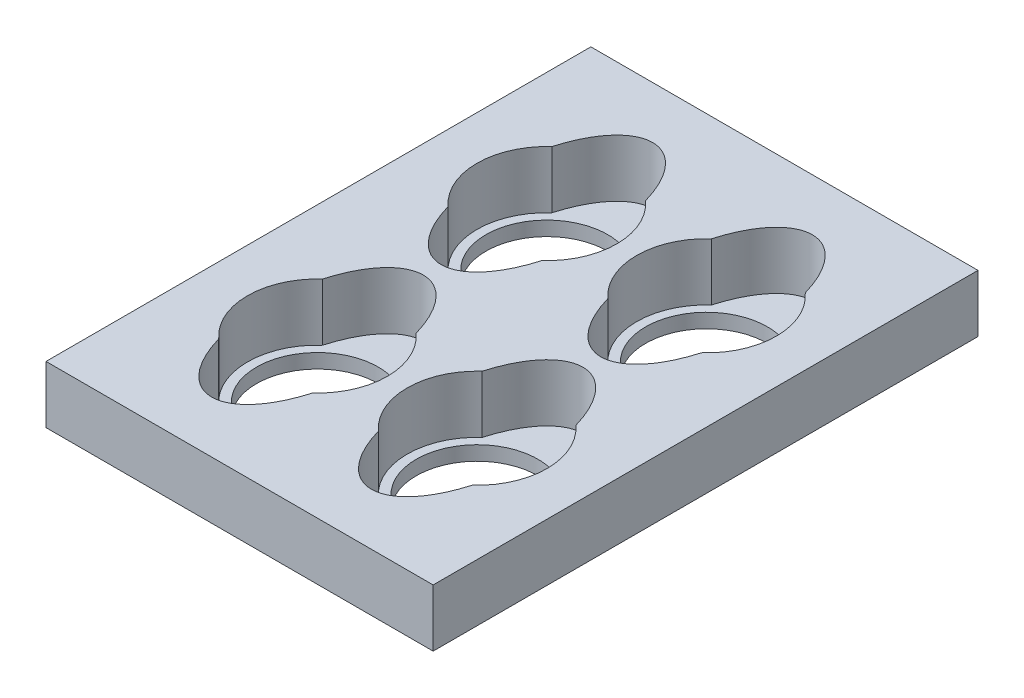
ISO-10303-21;
HEADER;
FILE_DESCRIPTION(('STEP AP214'),'2;1');
FILE_NAME('part.step','',(''),(''),'','','');
FILE_SCHEMA(('AUTOMOTIVE_DESIGN { 1 0 10303 214 1 1 1 1 }'));
ENDSEC;
DATA;
#1=APPLICATION_CONTEXT('core data for automotive mechanical design processes');
#2=APPLICATION_PROTOCOL_DEFINITION('international standard','automotive_design',2000,#1);
#3=PRODUCT_CONTEXT('',#1,'mechanical');
#4=PRODUCT('Part','Part','',(#3));
#5=PRODUCT_RELATED_PRODUCT_CATEGORY('part','',(#4));
#6=PRODUCT_DEFINITION_FORMATION('','',#4);
#7=PRODUCT_DEFINITION_CONTEXT('part definition',#1,'design');
#8=PRODUCT_DEFINITION('design','',#6,#7);
#9=PRODUCT_DEFINITION_SHAPE('','',#8);
#10=(LENGTH_UNIT() NAMED_UNIT(*) SI_UNIT(.MILLI.,.METRE.));
#11=(NAMED_UNIT(*) PLANE_ANGLE_UNIT() SI_UNIT($,.RADIAN.));
#12=(NAMED_UNIT(*) SI_UNIT($,.STERADIAN.) SOLID_ANGLE_UNIT());
#13=UNCERTAINTY_MEASURE_WITH_UNIT(LENGTH_MEASURE(1.E-05),#10,'distance_accuracy_value','');
#14=(GEOMETRIC_REPRESENTATION_CONTEXT(3) GLOBAL_UNCERTAINTY_ASSIGNED_CONTEXT((#13)) GLOBAL_UNIT_ASSIGNED_CONTEXT((#10,
#11,#12)) REPRESENTATION_CONTEXT('',''));
#15=CARTESIAN_POINT('',(0.,0.,0.));
#16=DIRECTION('',(0.,0.,1.));
#17=DIRECTION('',(1.,0.,0.));
#18=AXIS2_PLACEMENT_3D('',#15,#16,#17);
#19=CARTESIAN_POINT('',(0.,0.,0.));
#20=DIRECTION('',(0.,1.,0.));
#21=DIRECTION('',(0.,0.,1.));
#22=AXIS2_PLACEMENT_3D('',#19,#20,#21);
#23=PLANE('',#22);
#24=DIRECTION('',(0.,0.,-1.));
#25=VECTOR('',#24,1.);
#26=CARTESIAN_POINT('',(54.,0.,-76.));
#27=LINE('',#26,#25);
#28=CARTESIAN_POINT('',(54.,0.,76.));
#29=VERTEX_POINT('',#28);
#30=CARTESIAN_POINT('',(54.,0.,-76.));
#31=VERTEX_POINT('',#30);
#32=EDGE_CURVE('E421',#29,#31,#27,.T.);
#33=ORIENTED_EDGE('',*,*,#32,.F.);
#34=DIRECTION('',(1.,0.,0.));
#35=VECTOR('',#34,1.);
#36=CARTESIAN_POINT('',(-54.,0.,76.));
#37=LINE('',#36,#35);
#38=CARTESIAN_POINT('',(-54.,0.,76.));
#39=VERTEX_POINT('',#38);
#40=EDGE_CURVE('E431',#39,#29,#37,.T.);
#41=ORIENTED_EDGE('',*,*,#40,.F.);
#42=DIRECTION('',(0.,0.,1.));
#43=VECTOR('',#42,1.);
#44=CARTESIAN_POINT('',(-54.,0.,-76.));
#45=LINE('',#44,#43);
#46=CARTESIAN_POINT('',(-54.,0.,-76.));
#47=VERTEX_POINT('',#46);
#48=EDGE_CURVE('E420',#47,#39,#45,.T.);
#49=ORIENTED_EDGE('',*,*,#48,.F.);
#50=DIRECTION('',(-1.,0.,0.));
#51=VECTOR('',#50,1.);
#52=CARTESIAN_POINT('',(-54.,0.,-76.));
#53=LINE('',#52,#51);
#54=EDGE_CURVE('E412',#31,#47,#53,.T.);
#55=ORIENTED_EDGE('',*,*,#54,.F.);
#56=EDGE_LOOP('',(#33,#41,#49,#55));
#57=FACE_BOUND('',#56,.T.);
#58=DIRECTION('',(0.,0.,1.));
#59=VECTOR('',#58,1.);
#60=CARTESIAN_POINT('',(49.,0.,-69.));
#61=LINE('',#60,#59);
#62=CARTESIAN_POINT('',(49.,0.,-69.));
#63=VERTEX_POINT('',#62);
#64=CARTESIAN_POINT('',(49.,0.,69.));
#65=VERTEX_POINT('',#64);
#66=EDGE_CURVE('E573',#63,#65,#61,.T.);
#67=ORIENTED_EDGE('',*,*,#66,.F.);
#68=DIRECTION('',(1.,0.,0.));
#69=VECTOR('',#68,1.);
#70=CARTESIAN_POINT('',(-49.,0.,-69.));
#71=LINE('',#70,#69);
#72=CARTESIAN_POINT('',(-49.,0.,-69.));
#73=VERTEX_POINT('',#72);
#74=EDGE_CURVE('E568',#73,#63,#71,.T.);
#75=ORIENTED_EDGE('',*,*,#74,.F.);
#76=DIRECTION('',(0.,0.,-1.));
#77=VECTOR('',#76,1.);
#78=CARTESIAN_POINT('',(-49.,0.,-69.));
#79=LINE('',#78,#77);
#80=CARTESIAN_POINT('',(-49.,0.,69.));
#81=VERTEX_POINT('',#80);
#82=EDGE_CURVE('E607',#81,#73,#79,.T.);
#83=ORIENTED_EDGE('',*,*,#82,.F.);
#84=DIRECTION('',(-1.,0.,0.));
#85=VECTOR('',#84,1.);
#86=CARTESIAN_POINT('',(-49.,0.,69.));
#87=LINE('',#86,#85);
#88=EDGE_CURVE('E611',#65,#81,#87,.T.);
#89=ORIENTED_EDGE('',*,*,#88,.F.);
#90=EDGE_LOOP('',(#67,#75,#83,#89));
#91=FACE_BOUND('',#90,.T.);
#92=ADVANCED_FACE('F67',(#57,#91),#23,.F.);
#93=CARTESIAN_POINT('',(54.,16.,-76.));
#94=DIRECTION('',(-1.,0.,0.));
#95=DIRECTION('',(0.,0.,1.));
#96=AXIS2_PLACEMENT_3D('',#93,#94,#95);
#97=PLANE('',#96);
#98=ORIENTED_EDGE('',*,*,#32,.T.);
#99=DIRECTION('',(0.,-1.,0.));
#100=VECTOR('',#99,1.);
#101=CARTESIAN_POINT('',(54.,16.,-76.));
#102=LINE('',#101,#100);
#103=CARTESIAN_POINT('',(54.,16.,-76.));
#104=VERTEX_POINT('',#103);
#105=EDGE_CURVE('E12',#104,#31,#102,.T.);
#106=ORIENTED_EDGE('',*,*,#105,.F.);
#107=DIRECTION('',(0.,0.,-1.));
#108=VECTOR('',#107,1.);
#109=CARTESIAN_POINT('',(54.,16.,-76.));
#110=LINE('',#109,#108);
#111=CARTESIAN_POINT('',(54.,16.,76.));
#112=VERTEX_POINT('',#111);
#113=EDGE_CURVE('E435',#112,#104,#110,.T.);
#114=ORIENTED_EDGE('',*,*,#113,.F.);
#115=DIRECTION('',(0.,-1.,0.));
#116=VECTOR('',#115,1.);
#117=CARTESIAN_POINT('',(54.,16.,76.));
#118=LINE('',#117,#116);
#119=EDGE_CURVE('E439',#112,#29,#118,.T.);
#120=ORIENTED_EDGE('',*,*,#119,.T.);
#121=EDGE_LOOP('',(#98,#106,#114,#120));
#122=FACE_BOUND('',#121,.T.);
#123=ADVANCED_FACE('F69',(#122),#97,.F.);
#124=CARTESIAN_POINT('',(-54.,16.,-76.));
#125=DIRECTION('',(0.,0.,1.));
#126=DIRECTION('',(1.,0.,0.));
#127=AXIS2_PLACEMENT_3D('',#124,#125,#126);
#128=PLANE('',#127);
#129=ORIENTED_EDGE('',*,*,#54,.T.);
#130=DIRECTION('',(0.,-1.,0.));
#131=VECTOR('',#130,1.);
#132=CARTESIAN_POINT('',(-54.,16.,-76.));
#133=LINE('',#132,#131);
#134=CARTESIAN_POINT('',(-54.,16.,-76.));
#135=VERTEX_POINT('',#134);
#136=EDGE_CURVE('E77',#135,#47,#133,.T.);
#137=ORIENTED_EDGE('',*,*,#136,.F.);
#138=DIRECTION('',(-1.,0.,0.));
#139=VECTOR('',#138,1.);
#140=CARTESIAN_POINT('',(-54.,16.,-76.));
#141=LINE('',#140,#139);
#142=EDGE_CURVE('E588',#104,#135,#141,.T.);
#143=ORIENTED_EDGE('',*,*,#142,.F.);
#144=ORIENTED_EDGE('',*,*,#105,.T.);
#145=EDGE_LOOP('',(#129,#137,#143,#144));
#146=FACE_BOUND('',#145,.T.);
#147=ADVANCED_FACE('F403',(#146),#128,.F.);
#148=CARTESIAN_POINT('',(-54.,16.,-76.));
#149=DIRECTION('',(1.,0.,0.));
#150=DIRECTION('',(0.,0.,-1.));
#151=AXIS2_PLACEMENT_3D('',#148,#149,#150);
#152=PLANE('',#151);
#153=ORIENTED_EDGE('',*,*,#48,.T.);
#154=DIRECTION('',(0.,-1.,0.));
#155=VECTOR('',#154,1.);
#156=CARTESIAN_POINT('',(-54.,16.,76.));
#157=LINE('',#156,#155);
#158=CARTESIAN_POINT('',(-54.,16.,76.));
#159=VERTEX_POINT('',#158);
#160=EDGE_CURVE('E427',#159,#39,#157,.T.);
#161=ORIENTED_EDGE('',*,*,#160,.F.);
#162=DIRECTION('',(0.,0.,1.));
#163=VECTOR('',#162,1.);
#164=CARTESIAN_POINT('',(-54.,16.,-76.));
#165=LINE('',#164,#163);
#166=EDGE_CURVE('E425',#135,#159,#165,.T.);
#167=ORIENTED_EDGE('',*,*,#166,.F.);
#168=ORIENTED_EDGE('',*,*,#136,.T.);
#169=EDGE_LOOP('',(#153,#161,#167,#168));
#170=FACE_BOUND('',#169,.T.);
#171=ADVANCED_FACE('F400',(#170),#152,.F.);
#172=CARTESIAN_POINT('',(-54.,16.,76.));
#173=DIRECTION('',(0.,0.,-1.));
#174=DIRECTION('',(-1.,0.,0.));
#175=AXIS2_PLACEMENT_3D('',#172,#173,#174);
#176=PLANE('',#175);
#177=ORIENTED_EDGE('',*,*,#40,.T.);
#178=ORIENTED_EDGE('',*,*,#119,.F.);
#179=DIRECTION('',(1.,0.,0.));
#180=VECTOR('',#179,1.);
#181=CARTESIAN_POINT('',(-54.,16.,76.));
#182=LINE('',#181,#180);
#183=EDGE_CURVE('E443',#159,#112,#182,.T.);
#184=ORIENTED_EDGE('',*,*,#183,.F.);
#185=ORIENTED_EDGE('',*,*,#160,.T.);
#186=EDGE_LOOP('',(#177,#178,#184,#185));
#187=FACE_BOUND('',#186,.T.);
#188=ADVANCED_FACE('F393',(#187),#176,.F.);
#189=CARTESIAN_POINT('',(0.,16.,0.));
#190=DIRECTION('',(0.,1.,0.));
#191=DIRECTION('',(0.,0.,1.));
#192=AXIS2_PLACEMENT_3D('',#189,#190,#191);
#193=PLANE('',#192);
#194=CARTESIAN_POINT('',(-22.2719493735013,16.,-32.));
#195=DIRECTION('',(0.,1.,0.));
#196=DIRECTION('',(0.,0.,-1.));
#197=AXIS2_PLACEMENT_3D('',#194,#195,#196);
#198=ELLIPSE('',#197,29.5,15.);
#199=CARTESIAN_POINT('',(-35.3434453169329,16.,-17.5298239886015));
#200=VERTEX_POINT('',#199);
#201=CARTESIAN_POINT('',(-9.20045343006976,16.,-17.5298239886015));
#202=VERTEX_POINT('',#201);
#203=EDGE_CURVE('E328',#200,#202,#198,.T.);
#204=ORIENTED_EDGE('',*,*,#203,.F.);
#205=CARTESIAN_POINT('',(-22.2719493735013,16.,-32.));
#206=DIRECTION('',(0.,1.,0.));
#207=DIRECTION('',(0.,0.,1.));
#208=AXIS2_PLACEMENT_3D('',#205,#206,#207);
#209=CIRCLE('',#208,19.5);
#210=CARTESIAN_POINT('',(-35.3434453169329,16.,-46.4701760113985));
#211=VERTEX_POINT('',#210);
#212=EDGE_CURVE('E333',#211,#200,#209,.T.);
#213=ORIENTED_EDGE('',*,*,#212,.F.);
#214=CARTESIAN_POINT('',(-9.20045343006976,16.,-46.4701760113985));
#215=VERTEX_POINT('',#214);
#216=EDGE_CURVE('E271',#215,#211,#198,.T.);
#217=ORIENTED_EDGE('',*,*,#216,.F.);
#218=EDGE_CURVE('E85',#202,#215,#209,.T.);
#219=ORIENTED_EDGE('',*,*,#218,.F.);
#220=EDGE_LOOP('',(#204,#213,#217,#219));
#221=FACE_BOUND('',#220,.T.);
#222=CARTESIAN_POINT('',(-22.2719493735013,16.,32.));
#223=DIRECTION('',(0.,1.,0.));
#224=DIRECTION('',(0.,0.,1.));
#225=AXIS2_PLACEMENT_3D('',#222,#223,#224);
#226=ELLIPSE('',#225,29.5,15.);
#227=CARTESIAN_POINT('',(-35.3434453169329,16.,46.4701760113985));
#228=VERTEX_POINT('',#227);
#229=CARTESIAN_POINT('',(-9.20045343006976,16.,46.4701760113985));
#230=VERTEX_POINT('',#229);
#231=EDGE_CURVE('E281',#228,#230,#226,.T.);
#232=ORIENTED_EDGE('',*,*,#231,.F.);
#233=CARTESIAN_POINT('',(-22.2719493735013,16.,32.));
#234=DIRECTION('',(0.,1.,0.));
#235=DIRECTION('',(0.,0.,1.));
#236=AXIS2_PLACEMENT_3D('',#233,#234,#235);
#237=CIRCLE('',#236,19.5);
#238=CARTESIAN_POINT('',(-35.3434453169329,16.,17.5298239886015));
#239=VERTEX_POINT('',#238);
#240=EDGE_CURVE('E499',#239,#228,#237,.T.);
#241=ORIENTED_EDGE('',*,*,#240,.F.);
#242=CARTESIAN_POINT('',(-9.20045343006976,16.,17.5298239886015));
#243=VERTEX_POINT('',#242);
#244=EDGE_CURVE('E285',#243,#239,#226,.T.);
#245=ORIENTED_EDGE('',*,*,#244,.F.);
#246=EDGE_CURVE('E93',#230,#243,#237,.T.);
#247=ORIENTED_EDGE('',*,*,#246,.F.);
#248=EDGE_LOOP('',(#232,#241,#245,#247));
#249=FACE_BOUND('',#248,.T.);
#250=CARTESIAN_POINT('',(22.2719493735013,16.,32.));
#251=DIRECTION('',(0.,1.,0.));
#252=DIRECTION('',(0.,0.,1.));
#253=AXIS2_PLACEMENT_3D('',#250,#251,#252);
#254=ELLIPSE('',#253,29.5,15.);
#255=CARTESIAN_POINT('',(9.20045343006977,16.,46.4701760113985));
#256=VERTEX_POINT('',#255);
#257=CARTESIAN_POINT('',(35.3434453169329,16.,46.4701760113985));
#258=VERTEX_POINT('',#257);
#259=EDGE_CURVE('E514',#256,#258,#254,.T.);
#260=ORIENTED_EDGE('',*,*,#259,.F.);
#261=CARTESIAN_POINT('',(22.2719493735013,16.,32.));
#262=DIRECTION('',(0.,1.,0.));
#263=DIRECTION('',(0.,0.,1.));
#264=AXIS2_PLACEMENT_3D('',#261,#262,#263);
#265=CIRCLE('',#264,19.5);
#266=CARTESIAN_POINT('',(9.20045343006977,16.,17.5298239886015));
#267=VERTEX_POINT('',#266);
#268=EDGE_CURVE('E237',#267,#256,#265,.T.);
#269=ORIENTED_EDGE('',*,*,#268,.F.);
#270=CARTESIAN_POINT('',(35.3434453169329,16.,17.5298239886015));
#271=VERTEX_POINT('',#270);
#272=EDGE_CURVE('E252',#271,#267,#254,.T.);
#273=ORIENTED_EDGE('',*,*,#272,.F.);
#274=EDGE_CURVE('E259',#258,#271,#265,.T.);
#275=ORIENTED_EDGE('',*,*,#274,.F.);
#276=EDGE_LOOP('',(#260,#269,#273,#275));
#277=FACE_BOUND('',#276,.T.);
#278=CARTESIAN_POINT('',(22.2719493735013,16.,-32.));
#279=DIRECTION('',(0.,1.,0.));
#280=DIRECTION('',(0.,0.,-1.));
#281=AXIS2_PLACEMENT_3D('',#278,#279,#280);
#282=ELLIPSE('',#281,29.5,15.);
#283=CARTESIAN_POINT('',(9.20045343006978,16.,-17.5298239886015));
#284=VERTEX_POINT('',#283);
#285=CARTESIAN_POINT('',(35.3434453169329,16.,-17.5298239886015));
#286=VERTEX_POINT('',#285);
#287=EDGE_CURVE('E356',#284,#286,#282,.T.);
#288=ORIENTED_EDGE('',*,*,#287,.F.);
#289=CARTESIAN_POINT('',(22.2719493735013,16.,-32.));
#290=DIRECTION('',(0.,1.,0.));
#291=DIRECTION('',(0.,0.,1.));
#292=AXIS2_PLACEMENT_3D('',#289,#290,#291);
#293=CIRCLE('',#292,19.5);
#294=CARTESIAN_POINT('',(9.20045343006978,16.,-46.4701760113985));
#295=VERTEX_POINT('',#294);
#296=EDGE_CURVE('E349',#295,#284,#293,.T.);
#297=ORIENTED_EDGE('',*,*,#296,.F.);
#298=CARTESIAN_POINT('',(35.3434453169329,16.,-46.4701760113985));
#299=VERTEX_POINT('',#298);
#300=EDGE_CURVE('E357',#299,#295,#282,.T.);
#301=ORIENTED_EDGE('',*,*,#300,.F.);
#302=EDGE_CURVE('E346',#286,#299,#293,.T.);
#303=ORIENTED_EDGE('',*,*,#302,.F.);
#304=EDGE_LOOP('',(#288,#297,#301,#303));
#305=FACE_BOUND('',#304,.T.);
#306=ORIENTED_EDGE('',*,*,#113,.T.);
#307=ORIENTED_EDGE('',*,*,#142,.T.);
#308=ORIENTED_EDGE('',*,*,#166,.T.);
#309=ORIENTED_EDGE('',*,*,#183,.T.);
#310=EDGE_LOOP('',(#306,#307,#308,#309));
#311=FACE_BOUND('',#310,.T.);
#312=ADVANCED_FACE('F389',(#221,#249,#277,#305,#311),#193,.T.);
#313=CARTESIAN_POINT('',(49.,-4.,-69.));
#314=DIRECTION('',(-1.,0.,0.));
#315=DIRECTION('',(0.,0.,1.));
#316=AXIS2_PLACEMENT_3D('',#313,#314,#315);
#317=PLANE('',#316);
#318=ORIENTED_EDGE('',*,*,#66,.T.);
#319=DIRECTION('',(0.,1.,0.));
#320=VECTOR('',#319,1.);
#321=CARTESIAN_POINT('',(49.,-4.,69.));
#322=LINE('',#321,#320);
#323=CARTESIAN_POINT('',(49.,-4.,69.));
#324=VERTEX_POINT('',#323);
#325=EDGE_CURVE('E572',#324,#65,#322,.T.);
#326=ORIENTED_EDGE('',*,*,#325,.F.);
#327=DIRECTION('',(0.,0.,1.));
#328=VECTOR('',#327,1.);
#329=CARTESIAN_POINT('',(49.,-4.,-69.));
#330=LINE('',#329,#328);
#331=CARTESIAN_POINT('',(49.,-4.,-69.));
#332=VERTEX_POINT('',#331);
#333=EDGE_CURVE('E559',#332,#324,#330,.T.);
#334=ORIENTED_EDGE('',*,*,#333,.F.);
#335=DIRECTION('',(0.,1.,0.));
#336=VECTOR('',#335,1.);
#337=CARTESIAN_POINT('',(49.,-4.,-69.));
#338=LINE('',#337,#336);
#339=EDGE_CURVE('E601',#332,#63,#338,.T.);
#340=ORIENTED_EDGE('',*,*,#339,.T.);
#341=EDGE_LOOP('',(#318,#326,#334,#340));
#342=FACE_BOUND('',#341,.T.);
#343=ADVANCED_FACE('F385',(#342),#317,.F.);
#344=CARTESIAN_POINT('',(-49.,-4.,69.));
#345=DIRECTION('',(0.,0.,-1.));
#346=DIRECTION('',(-1.,0.,0.));
#347=AXIS2_PLACEMENT_3D('',#344,#345,#346);
#348=PLANE('',#347);
#349=ORIENTED_EDGE('',*,*,#88,.T.);
#350=DIRECTION('',(0.,1.,0.));
#351=VECTOR('',#350,1.);
#352=CARTESIAN_POINT('',(-49.,-4.,69.));
#353=LINE('',#352,#351);
#354=CARTESIAN_POINT('',(-49.,-4.,69.));
#355=VERTEX_POINT('',#354);
#356=EDGE_CURVE('E576',#355,#81,#353,.T.);
#357=ORIENTED_EDGE('',*,*,#356,.F.);
#358=DIRECTION('',(-1.,0.,0.));
#359=VECTOR('',#358,1.);
#360=CARTESIAN_POINT('',(-49.,-4.,69.));
#361=LINE('',#360,#359);
#362=EDGE_CURVE('E561',#324,#355,#361,.T.);
#363=ORIENTED_EDGE('',*,*,#362,.F.);
#364=ORIENTED_EDGE('',*,*,#325,.T.);
#365=EDGE_LOOP('',(#349,#357,#363,#364));
#366=FACE_BOUND('',#365,.T.);
#367=ADVANCED_FACE('F381',(#366),#348,.F.);
#368=CARTESIAN_POINT('',(-49.,-4.,-69.));
#369=DIRECTION('',(1.,0.,0.));
#370=DIRECTION('',(0.,0.,-1.));
#371=AXIS2_PLACEMENT_3D('',#368,#369,#370);
#372=PLANE('',#371);
#373=ORIENTED_EDGE('',*,*,#82,.T.);
#374=DIRECTION('',(0.,1.,0.));
#375=VECTOR('',#374,1.);
#376=CARTESIAN_POINT('',(-49.,-4.,-69.));
#377=LINE('',#376,#375);
#378=CARTESIAN_POINT('',(-49.,-4.,-69.));
#379=VERTEX_POINT('',#378);
#380=EDGE_CURVE('E581',#379,#73,#377,.T.);
#381=ORIENTED_EDGE('',*,*,#380,.F.);
#382=DIRECTION('',(0.,0.,-1.));
#383=VECTOR('',#382,1.);
#384=CARTESIAN_POINT('',(-49.,-4.,-69.));
#385=LINE('',#384,#383);
#386=EDGE_CURVE('E619',#355,#379,#385,.T.);
#387=ORIENTED_EDGE('',*,*,#386,.F.);
#388=ORIENTED_EDGE('',*,*,#356,.T.);
#389=EDGE_LOOP('',(#373,#381,#387,#388));
#390=FACE_BOUND('',#389,.T.);
#391=ADVANCED_FACE('F377',(#390),#372,.F.);
#392=CARTESIAN_POINT('',(-49.,-4.,-69.));
#393=DIRECTION('',(0.,0.,1.));
#394=DIRECTION('',(1.,0.,0.));
#395=AXIS2_PLACEMENT_3D('',#392,#393,#394);
#396=PLANE('',#395);
#397=ORIENTED_EDGE('',*,*,#74,.T.);
#398=ORIENTED_EDGE('',*,*,#339,.F.);
#399=DIRECTION('',(1.,0.,0.));
#400=VECTOR('',#399,1.);
#401=CARTESIAN_POINT('',(-49.,-4.,-69.));
#402=LINE('',#401,#400);
#403=EDGE_CURVE('E564',#379,#332,#402,.T.);
#404=ORIENTED_EDGE('',*,*,#403,.F.);
#405=ORIENTED_EDGE('',*,*,#380,.T.);
#406=EDGE_LOOP('',(#397,#398,#404,#405));
#407=FACE_BOUND('',#406,.T.);
#408=ADVANCED_FACE('F372',(#407),#396,.F.);
#409=CARTESIAN_POINT('',(0.,-4.,0.));
#410=DIRECTION('',(0.,1.,0.));
#411=DIRECTION('',(0.,0.,1.));
#412=AXIS2_PLACEMENT_3D('',#409,#410,#411);
#413=PLANE('',#412);
#414=CARTESIAN_POINT('',(-22.2719493735013,-4.,32.));
#415=DIRECTION('',(0.,1.,0.));
#416=DIRECTION('',(0.,0.,1.));
#417=AXIS2_PLACEMENT_3D('',#414,#415,#416);
#418=CIRCLE('',#417,17.);
#419=CARTESIAN_POINT('',(-22.2719493735013,-4.,49.));
#420=VERTEX_POINT('',#419);
#421=EDGE_CURVE('E71',#420,#420,#418,.T.);
#422=ORIENTED_EDGE('',*,*,#421,.T.);
#423=EDGE_LOOP('',(#422));
#424=FACE_BOUND('',#423,.T.);
#425=CARTESIAN_POINT('',(22.2719493735013,-4.,32.));
#426=DIRECTION('',(0.,1.,0.));
#427=DIRECTION('',(0.,0.,1.));
#428=AXIS2_PLACEMENT_3D('',#425,#426,#427);
#429=CIRCLE('',#428,17.);
#430=CARTESIAN_POINT('',(22.2719493735013,-4.,49.));
#431=VERTEX_POINT('',#430);
#432=EDGE_CURVE('E454',#431,#431,#429,.T.);
#433=ORIENTED_EDGE('',*,*,#432,.T.);
#434=EDGE_LOOP('',(#433));
#435=FACE_BOUND('',#434,.T.);
#436=CARTESIAN_POINT('',(22.2719493735013,-4.,-32.));
#437=DIRECTION('',(0.,1.,0.));
#438=DIRECTION('',(0.,0.,1.));
#439=AXIS2_PLACEMENT_3D('',#436,#437,#438);
#440=CIRCLE('',#439,17.);
#441=CARTESIAN_POINT('',(22.2719493735013,-4.,-15.));
#442=VERTEX_POINT('',#441);
#443=EDGE_CURVE('E450',#442,#442,#440,.T.);
#444=ORIENTED_EDGE('',*,*,#443,.T.);
#445=EDGE_LOOP('',(#444));
#446=FACE_BOUND('',#445,.T.);
#447=CARTESIAN_POINT('',(-22.2719493735013,-4.,-32.));
#448=DIRECTION('',(0.,1.,0.));
#449=DIRECTION('',(0.,0.,1.));
#450=AXIS2_PLACEMENT_3D('',#447,#448,#449);
#451=CIRCLE('',#450,17.);
#452=CARTESIAN_POINT('',(-22.2719493735013,-4.,-15.));
#453=VERTEX_POINT('',#452);
#454=EDGE_CURVE('E446',#453,#453,#451,.T.);
#455=ORIENTED_EDGE('',*,*,#454,.T.);
#456=EDGE_LOOP('',(#455));
#457=FACE_BOUND('',#456,.T.);
#458=ORIENTED_EDGE('',*,*,#333,.T.);
#459=ORIENTED_EDGE('',*,*,#362,.T.);
#460=ORIENTED_EDGE('',*,*,#386,.T.);
#461=ORIENTED_EDGE('',*,*,#403,.T.);
#462=EDGE_LOOP('',(#458,#459,#460,#461));
#463=FACE_BOUND('',#462,.T.);
#464=ADVANCED_FACE('F369',(#424,#435,#446,#457,#463),#413,.F.);
#465=CARTESIAN_POINT('',(22.2719493735013,0.,-32.));
#466=DIRECTION('',(0.,1.,0.));
#467=DIRECTION('',(0.,0.,1.));
#468=AXIS2_PLACEMENT_3D('',#465,#466,#467);
#469=PLANE('',#468);
#470=CARTESIAN_POINT('',(22.2719493735013,0.,-32.));
#471=DIRECTION('',(0.,1.,0.));
#472=DIRECTION('',(0.,0.,1.));
#473=AXIS2_PLACEMENT_3D('',#470,#471,#472);
#474=CIRCLE('',#473,17.);
#475=CARTESIAN_POINT('',(22.2719493735013,0.,-15.));
#476=VERTEX_POINT('',#475);
#477=EDGE_CURVE('E941',#476,#476,#474,.T.);
#478=ORIENTED_EDGE('',*,*,#477,.F.);
#479=EDGE_LOOP('',(#478));
#480=FACE_BOUND('',#479,.T.);
#481=CARTESIAN_POINT('',(22.2719493735013,0.,-32.));
#482=DIRECTION('',(0.,1.,0.));
#483=DIRECTION('',(0.,0.,1.));
#484=AXIS2_PLACEMENT_3D('',#481,#482,#483);
#485=CIRCLE('',#484,19.5);
#486=CARTESIAN_POINT('',(35.3434453169329,0.,-17.5298239886015));
#487=VERTEX_POINT('',#486);
#488=CARTESIAN_POINT('',(35.3434453169329,0.,-46.4701760113985));
#489=VERTEX_POINT('',#488);
#490=EDGE_CURVE('E340',#487,#489,#485,.T.);
#491=ORIENTED_EDGE('',*,*,#490,.T.);
#492=CARTESIAN_POINT('',(22.2719493735013,0.,-32.));
#493=DIRECTION('',(0.,1.,0.));
#494=DIRECTION('',(0.,0.,-1.));
#495=AXIS2_PLACEMENT_3D('',#492,#493,#494);
#496=ELLIPSE('',#495,29.5,15.);
#497=CARTESIAN_POINT('',(9.20045343006978,0.,-46.4701760113985));
#498=VERTEX_POINT('',#497);
#499=EDGE_CURVE('E350',#489,#498,#496,.T.);
#500=ORIENTED_EDGE('',*,*,#499,.T.);
#501=CARTESIAN_POINT('',(9.20045343006978,0.,-17.5298239886015));
#502=VERTEX_POINT('',#501);
#503=EDGE_CURVE('E345',#498,#502,#485,.T.);
#504=ORIENTED_EDGE('',*,*,#503,.T.);
#505=EDGE_CURVE('E355',#502,#487,#496,.T.);
#506=ORIENTED_EDGE('',*,*,#505,.T.);
#507=EDGE_LOOP('',(#491,#500,#504,#506));
#508=FACE_BOUND('',#507,.T.);
#509=ADVANCED_FACE('F366',(#480,#508),#469,.T.);
#510=CARTESIAN_POINT('',(22.2719493735013,0.,-32.));
#511=DIRECTION('',(0.,1.,0.));
#512=DIRECTION('',(0.,0.,1.));
#513=AXIS2_PLACEMENT_3D('',#510,#511,#512);
#514=CYLINDRICAL_SURFACE('',#513,19.5);
#515=DIRECTION('',(0.,1.,0.));
#516=VECTOR('',#515,1.);
#517=CARTESIAN_POINT('',(35.3434453169329,0.,-17.5298239886015));
#518=LINE('',#517,#516);
#519=EDGE_CURVE('E616',#487,#286,#518,.T.);
#520=ORIENTED_EDGE('',*,*,#519,.T.);
#521=ORIENTED_EDGE('',*,*,#302,.T.);
#522=DIRECTION('',(0.,1.,0.));
#523=VECTOR('',#522,1.);
#524=CARTESIAN_POINT('',(35.3434453169329,0.,-46.4701760113985));
#525=LINE('',#524,#523);
#526=EDGE_CURVE('E344',#299,#489,#525,.F.);
#527=ORIENTED_EDGE('',*,*,#526,.T.);
#528=ORIENTED_EDGE('',*,*,#490,.F.);
#529=EDGE_LOOP('',(#520,#521,#527,#528));
#530=FACE_BOUND('',#529,.T.);
#531=ADVANCED_FACE('F374',(#530),#514,.F.);
#532=DIRECTION('',(0.,1.,0.));
#533=VECTOR('',#532,1.);
#534=CARTESIAN_POINT('',(9.20045343006978,0.,-17.5298239886015));
#535=LINE('',#534,#533);
#536=EDGE_CURVE('E626',#284,#502,#535,.F.);
#537=ORIENTED_EDGE('',*,*,#536,.T.);
#538=ORIENTED_EDGE('',*,*,#503,.F.);
#539=DIRECTION('',(0.,1.,0.));
#540=VECTOR('',#539,1.);
#541=CARTESIAN_POINT('',(9.20045343006978,0.,-46.4701760113985));
#542=LINE('',#541,#540);
#543=EDGE_CURVE('E629',#498,#295,#542,.T.);
#544=ORIENTED_EDGE('',*,*,#543,.T.);
#545=ORIENTED_EDGE('',*,*,#296,.T.);
#546=EDGE_LOOP('',(#537,#538,#544,#545));
#547=FACE_BOUND('',#546,.T.);
#548=ADVANCED_FACE('F367',(#547),#514,.F.);
#549=DIRECTION('',(0.,1.,0.));
#550=VECTOR('',#549,1.);
#551=SURFACE_OF_LINEAR_EXTRUSION('',#496,#550);
#552=ORIENTED_EDGE('',*,*,#505,.F.);
#553=ORIENTED_EDGE('',*,*,#536,.F.);
#554=ORIENTED_EDGE('',*,*,#287,.T.);
#555=ORIENTED_EDGE('',*,*,#519,.F.);
#556=EDGE_LOOP('',(#552,#553,#554,#555));
#557=FACE_BOUND('',#556,.T.);
#558=ADVANCED_FACE('F364',(#557),#551,.F.);
#559=ORIENTED_EDGE('',*,*,#499,.F.);
#560=ORIENTED_EDGE('',*,*,#526,.F.);
#561=ORIENTED_EDGE('',*,*,#300,.T.);
#562=ORIENTED_EDGE('',*,*,#543,.F.);
#563=EDGE_LOOP('',(#559,#560,#561,#562));
#564=FACE_BOUND('',#563,.T.);
#565=ADVANCED_FACE('F360',(#564),#551,.F.);
#566=CARTESIAN_POINT('',(22.2719493735013,0.,32.));
#567=DIRECTION('',(0.,1.,0.));
#568=DIRECTION('',(0.,0.,1.));
#569=AXIS2_PLACEMENT_3D('',#566,#567,#568);
#570=PLANE('',#569);
#571=CARTESIAN_POINT('',(22.2719493735013,0.,32.));
#572=DIRECTION('',(0.,1.,0.));
#573=DIRECTION('',(0.,0.,1.));
#574=AXIS2_PLACEMENT_3D('',#571,#572,#573);
#575=CIRCLE('',#574,17.);
#576=CARTESIAN_POINT('',(22.2719493735013,0.,49.));
#577=VERTEX_POINT('',#576);
#578=EDGE_CURVE('E937',#577,#577,#575,.T.);
#579=ORIENTED_EDGE('',*,*,#578,.F.);
#580=EDGE_LOOP('',(#579));
#581=FACE_BOUND('',#580,.T.);
#582=CARTESIAN_POINT('',(22.2719493735013,0.,32.));
#583=DIRECTION('',(0.,1.,0.));
#584=DIRECTION('',(0.,0.,1.));
#585=AXIS2_PLACEMENT_3D('',#582,#583,#584);
#586=ELLIPSE('',#585,29.5,15.);
#587=CARTESIAN_POINT('',(35.3434453169329,0.,17.5298239886015));
#588=VERTEX_POINT('',#587);
#589=CARTESIAN_POINT('',(9.20045343006977,0.,17.5298239886015));
#590=VERTEX_POINT('',#589);
#591=EDGE_CURVE('E253',#588,#590,#586,.T.);
#592=ORIENTED_EDGE('',*,*,#591,.T.);
#593=CARTESIAN_POINT('',(22.2719493735013,0.,32.));
#594=DIRECTION('',(0.,1.,0.));
#595=DIRECTION('',(0.,0.,1.));
#596=AXIS2_PLACEMENT_3D('',#593,#594,#595);
#597=CIRCLE('',#596,19.5);
#598=CARTESIAN_POINT('',(9.20045343006977,0.,46.4701760113985));
#599=VERTEX_POINT('',#598);
#600=EDGE_CURVE('E235',#590,#599,#597,.T.);
#601=ORIENTED_EDGE('',*,*,#600,.T.);
#602=CARTESIAN_POINT('',(35.3434453169329,0.,46.4701760113985));
#603=VERTEX_POINT('',#602);
#604=EDGE_CURVE('E246',#599,#603,#586,.T.);
#605=ORIENTED_EDGE('',*,*,#604,.T.);
#606=EDGE_CURVE('E260',#603,#588,#597,.T.);
#607=ORIENTED_EDGE('',*,*,#606,.T.);
#608=EDGE_LOOP('',(#592,#601,#605,#607));
#609=FACE_BOUND('',#608,.T.);
#610=ADVANCED_FACE('F256',(#581,#609),#570,.T.);
#611=CARTESIAN_POINT('',(22.2719493735013,0.,32.));
#612=DIRECTION('',(0.,1.,0.));
#613=DIRECTION('',(0.,0.,1.));
#614=AXIS2_PLACEMENT_3D('',#611,#612,#613);
#615=CYLINDRICAL_SURFACE('',#614,19.5);
#616=DIRECTION('',(0.,1.,0.));
#617=VECTOR('',#616,1.);
#618=CARTESIAN_POINT('',(9.20045343006977,0.,46.4701760113985));
#619=LINE('',#618,#617);
#620=EDGE_CURVE('E231',#256,#599,#619,.F.);
#621=ORIENTED_EDGE('',*,*,#620,.T.);
#622=ORIENTED_EDGE('',*,*,#600,.F.);
#623=DIRECTION('',(0.,1.,0.));
#624=VECTOR('',#623,1.);
#625=CARTESIAN_POINT('',(9.20045343006977,0.,17.5298239886015));
#626=LINE('',#625,#624);
#627=EDGE_CURVE('E242',#590,#267,#626,.T.);
#628=ORIENTED_EDGE('',*,*,#627,.T.);
#629=ORIENTED_EDGE('',*,*,#268,.T.);
#630=EDGE_LOOP('',(#621,#622,#628,#629));
#631=FACE_BOUND('',#630,.T.);
#632=ADVANCED_FACE('F233',(#631),#615,.F.);
#633=DIRECTION('',(0.,1.,0.));
#634=VECTOR('',#633,1.);
#635=CARTESIAN_POINT('',(35.3434453169329,0.,46.4701760113985));
#636=LINE('',#635,#634);
#637=EDGE_CURVE('E243',#603,#258,#636,.T.);
#638=ORIENTED_EDGE('',*,*,#637,.T.);
#639=ORIENTED_EDGE('',*,*,#274,.T.);
#640=DIRECTION('',(0.,1.,0.));
#641=VECTOR('',#640,1.);
#642=CARTESIAN_POINT('',(35.3434453169329,0.,17.5298239886015));
#643=LINE('',#642,#641);
#644=EDGE_CURVE('E265',#271,#588,#643,.F.);
#645=ORIENTED_EDGE('',*,*,#644,.T.);
#646=ORIENTED_EDGE('',*,*,#606,.F.);
#647=EDGE_LOOP('',(#638,#639,#645,#646));
#648=FACE_BOUND('',#647,.T.);
#649=ADVANCED_FACE('F523',(#648),#615,.F.);
#650=DIRECTION('',(0.,1.,0.));
#651=VECTOR('',#650,1.);
#652=SURFACE_OF_LINEAR_EXTRUSION('',#586,#651);
#653=ORIENTED_EDGE('',*,*,#604,.F.);
#654=ORIENTED_EDGE('',*,*,#620,.F.);
#655=ORIENTED_EDGE('',*,*,#259,.T.);
#656=ORIENTED_EDGE('',*,*,#637,.F.);
#657=EDGE_LOOP('',(#653,#654,#655,#656));
#658=FACE_BOUND('',#657,.T.);
#659=ADVANCED_FACE('F247',(#658),#652,.F.);
#660=ORIENTED_EDGE('',*,*,#591,.F.);
#661=ORIENTED_EDGE('',*,*,#644,.F.);
#662=ORIENTED_EDGE('',*,*,#272,.T.);
#663=ORIENTED_EDGE('',*,*,#627,.F.);
#664=EDGE_LOOP('',(#660,#661,#662,#663));
#665=FACE_BOUND('',#664,.T.);
#666=ADVANCED_FACE('F310',(#665),#652,.F.);
#667=CARTESIAN_POINT('',(-22.2719493735013,0.,32.));
#668=DIRECTION('',(0.,1.,0.));
#669=DIRECTION('',(0.,0.,1.));
#670=AXIS2_PLACEMENT_3D('',#667,#668,#669);
#671=PLANE('',#670);
#672=CARTESIAN_POINT('',(-22.2719493735013,0.,32.));
#673=DIRECTION('',(0.,1.,0.));
#674=DIRECTION('',(0.,0.,1.));
#675=AXIS2_PLACEMENT_3D('',#672,#673,#674);
#676=CIRCLE('',#675,17.);
#677=CARTESIAN_POINT('',(-22.2719493735013,0.,49.));
#678=VERTEX_POINT('',#677);
#679=EDGE_CURVE('E935',#678,#678,#676,.T.);
#680=ORIENTED_EDGE('',*,*,#679,.F.);
#681=EDGE_LOOP('',(#680));
#682=FACE_BOUND('',#681,.T.);
#683=CARTESIAN_POINT('',(-22.2719493735013,0.,32.));
#684=DIRECTION('',(0.,1.,0.));
#685=DIRECTION('',(0.,0.,1.));
#686=AXIS2_PLACEMENT_3D('',#683,#684,#685);
#687=ELLIPSE('',#686,29.5,15.);
#688=CARTESIAN_POINT('',(-9.20045343006976,0.,17.5298239886015));
#689=VERTEX_POINT('',#688);
#690=CARTESIAN_POINT('',(-35.3434453169329,0.,17.5298239886015));
#691=VERTEX_POINT('',#690);
#692=EDGE_CURVE('E291',#689,#691,#687,.T.);
#693=ORIENTED_EDGE('',*,*,#692,.T.);
#694=CARTESIAN_POINT('',(-22.2719493735013,0.,32.));
#695=DIRECTION('',(0.,1.,0.));
#696=DIRECTION('',(0.,0.,1.));
#697=AXIS2_PLACEMENT_3D('',#694,#695,#696);
#698=CIRCLE('',#697,19.5);
#699=CARTESIAN_POINT('',(-35.3434453169329,0.,46.4701760113985));
#700=VERTEX_POINT('',#699);
#701=EDGE_CURVE('E495',#691,#700,#698,.T.);
#702=ORIENTED_EDGE('',*,*,#701,.T.);
#703=CARTESIAN_POINT('',(-9.20045343006976,0.,46.4701760113985));
#704=VERTEX_POINT('',#703);
#705=EDGE_CURVE('E286',#700,#704,#687,.T.);
#706=ORIENTED_EDGE('',*,*,#705,.T.);
#707=EDGE_CURVE('E280',#704,#689,#698,.T.);
#708=ORIENTED_EDGE('',*,*,#707,.T.);
#709=EDGE_LOOP('',(#693,#702,#706,#708));
#710=FACE_BOUND('',#709,.T.);
#711=ADVANCED_FACE('F301',(#682,#710),#671,.T.);
#712=CARTESIAN_POINT('',(-22.2719493735013,0.,32.));
#713=DIRECTION('',(0.,1.,0.));
#714=DIRECTION('',(0.,0.,1.));
#715=AXIS2_PLACEMENT_3D('',#712,#713,#714);
#716=CYLINDRICAL_SURFACE('',#715,19.5);
#717=DIRECTION('',(0.,1.,0.));
#718=VECTOR('',#717,1.);
#719=CARTESIAN_POINT('',(-35.3434453169329,0.,46.4701760113985));
#720=LINE('',#719,#718);
#721=EDGE_CURVE('E270',#228,#700,#720,.F.);
#722=ORIENTED_EDGE('',*,*,#721,.T.);
#723=ORIENTED_EDGE('',*,*,#701,.F.);
#724=DIRECTION('',(0.,1.,0.));
#725=VECTOR('',#724,1.);
#726=CARTESIAN_POINT('',(-35.3434453169329,0.,17.5298239886015));
#727=LINE('',#726,#725);
#728=EDGE_CURVE('E274',#691,#239,#727,.T.);
#729=ORIENTED_EDGE('',*,*,#728,.T.);
#730=ORIENTED_EDGE('',*,*,#240,.T.);
#731=EDGE_LOOP('',(#722,#723,#729,#730));
#732=FACE_BOUND('',#731,.T.);
#733=ADVANCED_FACE('F303',(#732),#716,.F.);
#734=DIRECTION('',(0.,1.,0.));
#735=VECTOR('',#734,1.);
#736=CARTESIAN_POINT('',(-9.20045343006976,0.,46.4701760113985));
#737=LINE('',#736,#735);
#738=EDGE_CURVE('E267',#704,#230,#737,.T.);
#739=ORIENTED_EDGE('',*,*,#738,.T.);
#740=ORIENTED_EDGE('',*,*,#246,.T.);
#741=DIRECTION('',(0.,1.,0.));
#742=VECTOR('',#741,1.);
#743=CARTESIAN_POINT('',(-9.20045343006976,0.,17.5298239886015));
#744=LINE('',#743,#742);
#745=EDGE_CURVE('E277',#243,#689,#744,.F.);
#746=ORIENTED_EDGE('',*,*,#745,.T.);
#747=ORIENTED_EDGE('',*,*,#707,.F.);
#748=EDGE_LOOP('',(#739,#740,#746,#747));
#749=FACE_BOUND('',#748,.T.);
#750=ADVANCED_FACE('F306',(#749),#716,.F.);
#751=DIRECTION('',(0.,1.,0.));
#752=VECTOR('',#751,1.);
#753=SURFACE_OF_LINEAR_EXTRUSION('',#687,#752);
#754=ORIENTED_EDGE('',*,*,#705,.F.);
#755=ORIENTED_EDGE('',*,*,#721,.F.);
#756=ORIENTED_EDGE('',*,*,#231,.T.);
#757=ORIENTED_EDGE('',*,*,#738,.F.);
#758=EDGE_LOOP('',(#754,#755,#756,#757));
#759=FACE_BOUND('',#758,.T.);
#760=ADVANCED_FACE('F299',(#759),#753,.F.);
#761=ORIENTED_EDGE('',*,*,#692,.F.);
#762=ORIENTED_EDGE('',*,*,#745,.F.);
#763=ORIENTED_EDGE('',*,*,#244,.T.);
#764=ORIENTED_EDGE('',*,*,#728,.F.);
#765=EDGE_LOOP('',(#761,#762,#763,#764));
#766=FACE_BOUND('',#765,.T.);
#767=ADVANCED_FACE('F294',(#766),#753,.F.);
#768=CARTESIAN_POINT('',(-22.2719493735013,0.,-32.));
#769=DIRECTION('',(0.,1.,0.));
#770=DIRECTION('',(0.,0.,1.));
#771=AXIS2_PLACEMENT_3D('',#768,#769,#770);
#772=PLANE('',#771);
#773=CARTESIAN_POINT('',(-22.2719493735013,0.,-32.));
#774=DIRECTION('',(0.,1.,0.));
#775=DIRECTION('',(0.,0.,1.));
#776=AXIS2_PLACEMENT_3D('',#773,#774,#775);
#777=CIRCLE('',#776,17.);
#778=CARTESIAN_POINT('',(-22.2719493735013,0.,-15.));
#779=VERTEX_POINT('',#778);
#780=EDGE_CURVE('E451',#779,#779,#777,.T.);
#781=ORIENTED_EDGE('',*,*,#780,.F.);
#782=EDGE_LOOP('',(#781));
#783=FACE_BOUND('',#782,.T.);
#784=CARTESIAN_POINT('',(-22.2719493735013,0.,-32.));
#785=DIRECTION('',(0.,1.,0.));
#786=DIRECTION('',(0.,0.,-1.));
#787=AXIS2_PLACEMENT_3D('',#784,#785,#786);
#788=ELLIPSE('',#787,29.5,15.);
#789=CARTESIAN_POINT('',(-35.3434453169329,0.,-17.5298239886015));
#790=VERTEX_POINT('',#789);
#791=CARTESIAN_POINT('',(-9.20045343006976,0.,-17.5298239886015));
#792=VERTEX_POINT('',#791);
#793=EDGE_CURVE('E329',#790,#792,#788,.T.);
#794=ORIENTED_EDGE('',*,*,#793,.T.);
#795=CARTESIAN_POINT('',(-22.2719493735013,0.,-32.));
#796=DIRECTION('',(0.,1.,0.));
#797=DIRECTION('',(0.,0.,1.));
#798=AXIS2_PLACEMENT_3D('',#795,#796,#797);
#799=CIRCLE('',#798,19.5);
#800=CARTESIAN_POINT('',(-9.20045343006976,0.,-46.4701760113985));
#801=VERTEX_POINT('',#800);
#802=EDGE_CURVE('E335',#792,#801,#799,.T.);
#803=ORIENTED_EDGE('',*,*,#802,.T.);
#804=CARTESIAN_POINT('',(-35.3434453169329,0.,-46.4701760113985));
#805=VERTEX_POINT('',#804);
#806=EDGE_CURVE('E322',#801,#805,#788,.T.);
#807=ORIENTED_EDGE('',*,*,#806,.T.);
#808=EDGE_CURVE('E334',#805,#790,#799,.T.);
#809=ORIENTED_EDGE('',*,*,#808,.T.);
#810=EDGE_LOOP('',(#794,#803,#807,#809));
#811=FACE_BOUND('',#810,.T.);
#812=ADVANCED_FACE('F298',(#783,#811),#772,.T.);
#813=CARTESIAN_POINT('',(-22.2719493735013,0.,-32.));
#814=DIRECTION('',(0.,1.,0.));
#815=DIRECTION('',(0.,0.,1.));
#816=AXIS2_PLACEMENT_3D('',#813,#814,#815);
#817=CYLINDRICAL_SURFACE('',#816,19.5);
#818=DIRECTION('',(0.,1.,0.));
#819=VECTOR('',#818,1.);
#820=CARTESIAN_POINT('',(-9.20045343006977,0.,-17.5298239886015));
#821=LINE('',#820,#819);
#822=EDGE_CURVE('E461',#792,#202,#821,.T.);
#823=ORIENTED_EDGE('',*,*,#822,.T.);
#824=ORIENTED_EDGE('',*,*,#218,.T.);
#825=DIRECTION('',(0.,1.,0.));
#826=VECTOR('',#825,1.);
#827=CARTESIAN_POINT('',(-9.20045343006976,0.,-46.4701760113985));
#828=LINE('',#827,#826);
#829=EDGE_CURVE('E339',#215,#801,#828,.F.);
#830=ORIENTED_EDGE('',*,*,#829,.T.);
#831=ORIENTED_EDGE('',*,*,#802,.F.);
#832=EDGE_LOOP('',(#823,#824,#830,#831));
#833=FACE_BOUND('',#832,.T.);
#834=ADVANCED_FACE('F312',(#833),#817,.F.);
#835=DIRECTION('',(0.,1.,0.));
#836=VECTOR('',#835,1.);
#837=CARTESIAN_POINT('',(-35.3434453169329,0.,-17.5298239886015));
#838=LINE('',#837,#836);
#839=EDGE_CURVE('E464',#200,#790,#838,.F.);
#840=ORIENTED_EDGE('',*,*,#839,.T.);
#841=ORIENTED_EDGE('',*,*,#808,.F.);
#842=DIRECTION('',(0.,1.,0.));
#843=VECTOR('',#842,1.);
#844=CARTESIAN_POINT('',(-35.3434453169329,0.,-46.4701760113985));
#845=LINE('',#844,#843);
#846=EDGE_CURVE('E469',#805,#211,#845,.T.);
#847=ORIENTED_EDGE('',*,*,#846,.T.);
#848=ORIENTED_EDGE('',*,*,#212,.T.);
#849=EDGE_LOOP('',(#840,#841,#847,#848));
#850=FACE_BOUND('',#849,.T.);
#851=ADVANCED_FACE('F320',(#850),#817,.F.);
#852=DIRECTION('',(0.,1.,0.));
#853=VECTOR('',#852,1.);
#854=SURFACE_OF_LINEAR_EXTRUSION('',#788,#853);
#855=ORIENTED_EDGE('',*,*,#793,.F.);
#856=ORIENTED_EDGE('',*,*,#839,.F.);
#857=ORIENTED_EDGE('',*,*,#203,.T.);
#858=ORIENTED_EDGE('',*,*,#822,.F.);
#859=EDGE_LOOP('',(#855,#856,#857,#858));
#860=FACE_BOUND('',#859,.T.);
#861=ADVANCED_FACE('F318',(#860),#854,.F.);
#862=ORIENTED_EDGE('',*,*,#806,.F.);
#863=ORIENTED_EDGE('',*,*,#829,.F.);
#864=ORIENTED_EDGE('',*,*,#216,.T.);
#865=ORIENTED_EDGE('',*,*,#846,.F.);
#866=EDGE_LOOP('',(#862,#863,#864,#865));
#867=FACE_BOUND('',#866,.T.);
#868=ADVANCED_FACE('F313',(#867),#854,.F.);
#869=CARTESIAN_POINT('',(-22.2719493735013,-10.,-32.));
#870=DIRECTION('',(0.,1.,0.));
#871=DIRECTION('',(0.,0.,1.));
#872=AXIS2_PLACEMENT_3D('',#869,#870,#871);
#873=CYLINDRICAL_SURFACE('',#872,17.);
#874=ORIENTED_EDGE('',*,*,#780,.T.);
#875=EDGE_LOOP('',(#874));
#876=FACE_BOUND('',#875,.T.);
#877=ORIENTED_EDGE('',*,*,#454,.F.);
#878=EDGE_LOOP('',(#877));
#879=FACE_BOUND('',#878,.T.);
#880=ADVANCED_FACE('F317',(#876,#879),#873,.F.);
#881=CARTESIAN_POINT('',(22.2719493735013,-10.,-32.));
#882=DIRECTION('',(0.,1.,0.));
#883=DIRECTION('',(0.,0.,1.));
#884=AXIS2_PLACEMENT_3D('',#881,#882,#883);
#885=CYLINDRICAL_SURFACE('',#884,17.);
#886=ORIENTED_EDGE('',*,*,#477,.T.);
#887=EDGE_LOOP('',(#886));
#888=FACE_BOUND('',#887,.T.);
#889=ORIENTED_EDGE('',*,*,#443,.F.);
#890=EDGE_LOOP('',(#889));
#891=FACE_BOUND('',#890,.T.);
#892=ADVANCED_FACE('F544',(#888,#891),#885,.F.);
#893=CARTESIAN_POINT('',(22.2719493735013,-10.,32.));
#894=DIRECTION('',(0.,1.,0.));
#895=DIRECTION('',(0.,0.,1.));
#896=AXIS2_PLACEMENT_3D('',#893,#894,#895);
#897=CYLINDRICAL_SURFACE('',#896,17.);
#898=ORIENTED_EDGE('',*,*,#578,.T.);
#899=EDGE_LOOP('',(#898));
#900=FACE_BOUND('',#899,.T.);
#901=ORIENTED_EDGE('',*,*,#432,.F.);
#902=EDGE_LOOP('',(#901));
#903=FACE_BOUND('',#902,.T.);
#904=ADVANCED_FACE('F549',(#900,#903),#897,.F.);
#905=CARTESIAN_POINT('',(-22.2719493735013,-10.,32.));
#906=DIRECTION('',(0.,1.,0.));
#907=DIRECTION('',(0.,0.,1.));
#908=AXIS2_PLACEMENT_3D('',#905,#906,#907);
#909=CYLINDRICAL_SURFACE('',#908,17.);
#910=ORIENTED_EDGE('',*,*,#679,.T.);
#911=EDGE_LOOP('',(#910));
#912=FACE_BOUND('',#911,.T.);
#913=ORIENTED_EDGE('',*,*,#421,.F.);
#914=EDGE_LOOP('',(#913));
#915=FACE_BOUND('',#914,.T.);
#916=ADVANCED_FACE('F878',(#912,#915),#909,.F.);
#917=CLOSED_SHELL('',(#92,#123,#147,#171,#188,#312,#343,#367,#391,#408,#464,#509,#531,#548,#558,
#565,#610,#632,#649,#659,#666,#711,#733,#750,#760,#767,#812,#834,#851,#861,#868,#880,#892,#904,#916));
#918=MANIFOLD_SOLID_BREP('B2',#917);
#919=ADVANCED_BREP_SHAPE_REPRESENTATION('',(#18,#918),#14);
#920=SHAPE_DEFINITION_REPRESENTATION(#9,#919);
ENDSEC;
END-ISO-10303-21;
